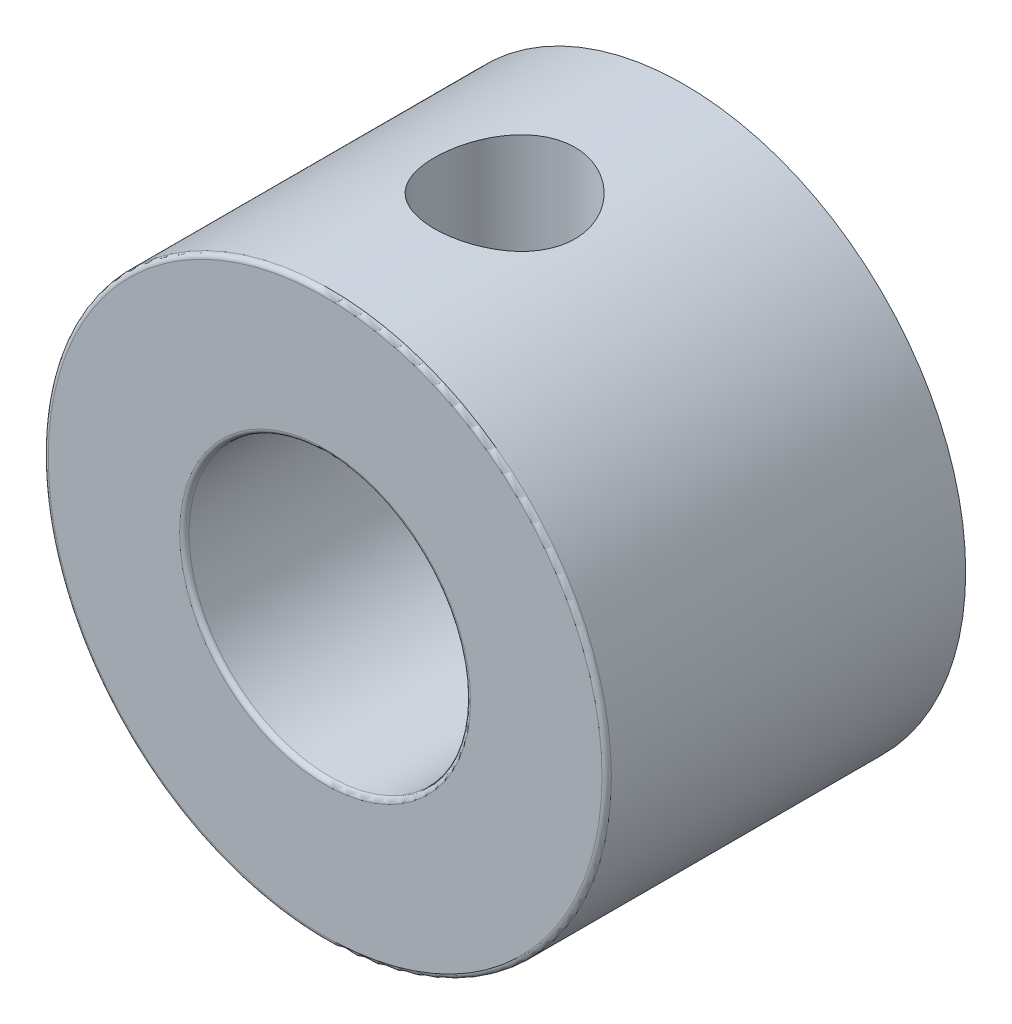
ISO-10303-21;
HEADER;
FILE_DESCRIPTION(('STEP AP214'),'2;1');
FILE_NAME('part.step','',(''),(''),'','','');
FILE_SCHEMA(('AUTOMOTIVE_DESIGN { 1 0 10303 214 1 1 1 1 }'));
ENDSEC;
DATA;
#1=APPLICATION_CONTEXT('core data for automotive mechanical design processes');
#2=APPLICATION_PROTOCOL_DEFINITION('international standard','automotive_design',2000,#1);
#3=PRODUCT_CONTEXT('',#1,'mechanical');
#4=PRODUCT('Part','Part','',(#3));
#5=PRODUCT_RELATED_PRODUCT_CATEGORY('part','',(#4));
#6=PRODUCT_DEFINITION_FORMATION('','',#4);
#7=PRODUCT_DEFINITION_CONTEXT('part definition',#1,'design');
#8=PRODUCT_DEFINITION('design','',#6,#7);
#9=PRODUCT_DEFINITION_SHAPE('','',#8);
#10=(LENGTH_UNIT() NAMED_UNIT(*) SI_UNIT(.MILLI.,.METRE.));
#11=(NAMED_UNIT(*) PLANE_ANGLE_UNIT() SI_UNIT($,.RADIAN.));
#12=(NAMED_UNIT(*) SI_UNIT($,.STERADIAN.) SOLID_ANGLE_UNIT());
#13=UNCERTAINTY_MEASURE_WITH_UNIT(LENGTH_MEASURE(1.E-05),#10,'distance_accuracy_value','');
#14=(GEOMETRIC_REPRESENTATION_CONTEXT(3) GLOBAL_UNCERTAINTY_ASSIGNED_CONTEXT((#13)) GLOBAL_UNIT_ASSIGNED_CONTEXT((#10,
#11,#12)) REPRESENTATION_CONTEXT('',''));
#15=CARTESIAN_POINT('',(0.,0.,0.));
#16=DIRECTION('',(0.,0.,1.));
#17=DIRECTION('',(1.,0.,0.));
#18=AXIS2_PLACEMENT_3D('',#15,#16,#17);
#19=CARTESIAN_POINT('',(0.,0.,3.825));
#20=DIRECTION('',(0.,0.,-1.));
#21=DIRECTION('',(-1.,0.,0.));
#22=AXIS2_PLACEMENT_3D('',#19,#20,#21);
#23=CYLINDRICAL_SURFACE('',#22,6.);
#24=CARTESIAN_POINT('',(0.,0.,3.725));
#25=DIRECTION('',(0.,0.,1.));
#26=DIRECTION('',(1.,0.,0.));
#27=AXIS2_PLACEMENT_3D('',#24,#25,#26);
#28=CIRCLE('',#27,6.);
#29=CARTESIAN_POINT('',(6.,0.,3.725));
#30=VERTEX_POINT('',#29);
#31=EDGE_CURVE('E10',#30,#30,#28,.F.);
#32=ORIENTED_EDGE('',*,*,#31,.T.);
#33=EDGE_LOOP('',(#32));
#34=FACE_BOUND('',#33,.T.);
#35=CARTESIAN_POINT('',(0.,0.,-3.825));
#36=DIRECTION('',(0.,0.,1.));
#37=DIRECTION('',(1.,0.,0.));
#38=AXIS2_PLACEMENT_3D('',#35,#36,#37);
#39=CIRCLE('',#38,6.);
#40=CARTESIAN_POINT('',(6.,0.,-3.825));
#41=VERTEX_POINT('',#40);
#42=EDGE_CURVE('E66',#41,#41,#39,.T.);
#43=ORIENTED_EDGE('',*,*,#42,.T.);
#44=EDGE_LOOP('',(#43));
#45=FACE_BOUND('',#44,.T.);
#46=CARTESIAN_POINT('',(0.,6.,-1.5));
#47=CARTESIAN_POINT('',(-0.0828760886697311,5.99999859868013,-1.49999767426184));
#48=CARTESIAN_POINT('',(-0.165778157830763,5.99826578131828,-1.49310844922621));
#49=CARTESIAN_POINT('',(-0.329206323770533,5.99152113829892,-1.465774848693));
#50=CARTESIAN_POINT('',(-0.409731046870739,5.98650745419968,-1.44532279046215));
#51=CARTESIAN_POINT('',(-0.566020872182577,5.9737562633204,-1.39156074653791));
#52=CARTESIAN_POINT('',(-0.641791563430003,5.96602202842087,-1.35826620128472));
#53=CARTESIAN_POINT('',(-0.786672131904427,5.94865343807593,-1.27981860995517));
#54=CARTESIAN_POINT('',(-0.85578178434876,5.9390190185405,-1.23466516388106));
#55=CARTESIAN_POINT('',(-0.98680192730092,5.91867413591801,-1.13279921034579));
#56=CARTESIAN_POINT('',(-1.04855569006107,5.90794707148533,-1.07588842504082));
#57=CARTESIAN_POINT('',(-1.1617489272033,5.8867362011753,-0.952547795091083));
#58=CARTESIAN_POINT('',(-1.21318723694913,5.87625242288348,-0.886116877053503));
#59=CARTESIAN_POINT('',(-1.30502654279903,5.8565477569971,-0.744404773262563));
#60=CARTESIAN_POINT('',(-1.34525221592536,5.84734794470605,-0.669006769189596));
#61=CARTESIAN_POINT('',(-1.41239690855053,5.83149494812223,-0.51225158834164));
#62=CARTESIAN_POINT('',(-1.43931805543933,5.82484135672789,-0.430895366674238));
#63=CARTESIAN_POINT('',(-1.47855483680429,5.81500476717551,-0.266256501797526));
#64=CARTESIAN_POINT('',(-1.49115226833334,5.81175491075426,-0.1830451039502));
#65=CARTESIAN_POINT('',(-1.50226177506785,5.80889362537741,-0.0156314309860182));
#66=CARTESIAN_POINT('',(-1.50077614181798,5.80928160448644,0.068570680698611));
#67=CARTESIAN_POINT('',(-1.48398652463928,5.81359205496618,0.233415807744482));
#68=CARTESIAN_POINT('',(-1.46901834019052,5.81742863001879,0.314095621465097));
#69=CARTESIAN_POINT('',(-1.42622418690311,5.82806709676484,0.471761050911293));
#70=CARTESIAN_POINT('',(-1.39839730206942,5.83486919970696,0.548746403028984));
#71=CARTESIAN_POINT('',(-1.33038947793715,5.85075113904187,0.697738016252066));
#72=CARTESIAN_POINT('',(-1.29008666723291,5.85985327469421,0.769686171789553));
#73=CARTESIAN_POINT('',(-1.19835627601495,5.87929710846386,0.905918709756838));
#74=CARTESIAN_POINT('',(-1.14692674880884,5.88963902334735,0.970201748067256));
#75=CARTESIAN_POINT('',(-1.03266342468122,5.91075880539781,1.0912036156944));
#76=CARTESIAN_POINT('',(-0.969546258165859,5.92154069477971,1.14765449006135));
#77=CARTESIAN_POINT('',(-0.8346119175037,5.94205965578786,1.2492212424639));
#78=CARTESIAN_POINT('',(-0.762794477707943,5.95179669549415,1.29433677426357));
#79=CARTESIAN_POINT('',(-0.612115888681391,5.96917732094183,1.37205058622439));
#80=CARTESIAN_POINT('',(-0.533231393208623,5.97681360127725,1.40460534025443));
#81=CARTESIAN_POINT('',(-0.370876008142883,5.98907916991419,1.45591730570957));
#82=CARTESIAN_POINT('',(-0.287405999150484,5.99370903339281,1.47467715641814));
#83=CARTESIAN_POINT('',(-0.120539970390026,5.99935499271375,1.49745756555884));
#84=CARTESIAN_POINT('',(-0.0371967199882089,6.00046053508279,1.5018430260753));
#85=CARTESIAN_POINT('',(0.129032874801509,5.99918804814451,1.49675099794451));
#86=CARTESIAN_POINT('',(0.211919259644596,5.99681033241847,1.48727475720087));
#87=CARTESIAN_POINT('',(0.373614268776492,5.98889581127357,1.45502909160862));
#88=CARTESIAN_POINT('',(0.452465118968755,5.98340634185811,1.43245873652301));
#89=CARTESIAN_POINT('',(0.605257292452512,5.96988706634134,1.37489291597155));
#90=CARTESIAN_POINT('',(0.679198119032635,5.96185700369892,1.33989619568683));
#91=CARTESIAN_POINT('',(0.821523134429848,5.94393307926311,1.25776387112527));
#92=CARTESIAN_POINT('',(0.889785441835831,5.93400867366932,1.21042388760324));
#93=CARTESIAN_POINT('',(1.01752661364325,5.91344509187419,1.10521009120303));
#94=CARTESIAN_POINT('',(1.07700395897301,5.90280579251705,1.04733446038309));
#95=CARTESIAN_POINT('',(1.18699056807273,5.88168956960771,0.920998039155535));
#96=CARTESIAN_POINT('',(1.23724386762203,5.87122304187281,0.852312296997577));
#97=CARTESIAN_POINT('',(1.3255107590127,5.85192878377239,0.707267365534282));
#98=CARTESIAN_POINT('',(1.36352489415794,5.84310098067026,0.630908517040246));
#99=CARTESIAN_POINT('',(1.42595142060929,5.82818094734665,0.473094277586921));
#100=CARTESIAN_POINT('',(1.45044439665407,5.82207255291906,0.39167237165599));
#101=CARTESIAN_POINT('',(1.48534565995378,5.81326744090184,0.225690362110891));
#102=CARTESIAN_POINT('',(1.49575702747866,5.81056997719936,0.141130948967509));
#103=CARTESIAN_POINT('',(1.50203859033399,5.80894901203957,-0.0261210238552032));
#104=CARTESIAN_POINT('',(1.49831789778012,5.80991932728264,-0.108797435124731));
#105=CARTESIAN_POINT('',(1.47737727831287,5.81527909007843,-0.272303888667982));
#106=CARTESIAN_POINT('',(1.46015762268677,5.81966846891857,-0.353133968013651));
#107=CARTESIAN_POINT('',(1.41293131944279,5.83131260682723,-0.510208459065409));
#108=CARTESIAN_POINT('',(1.38300140468038,5.8385501523631,-0.586477305240208));
#109=CARTESIAN_POINT('',(1.31126491360507,5.85507755724829,-0.73296538271369));
#110=CARTESIAN_POINT('',(1.26945669003419,5.86436770120773,-0.803183773186917));
#111=CARTESIAN_POINT('',(1.17386774863714,5.88425634263512,-0.937554629002021));
#112=CARTESIAN_POINT('',(1.11980316291225,5.89488264831757,-1.00150107342396));
#113=CARTESIAN_POINT('',(1.00178937118973,5.91608027246286,-1.11954704479541));
#114=CARTESIAN_POINT('',(0.937837821261145,5.9266515772706,-1.17364423011297));
#115=CARTESIAN_POINT('',(0.800467586702589,5.94677655647663,-1.27141130856461));
#116=CARTESIAN_POINT('',(0.726898422316385,5.95630833365868,-1.31487461367158));
#117=CARTESIAN_POINT('',(0.573266059510475,5.97304924975118,-1.38874746294053));
#118=CARTESIAN_POINT('',(0.493207563436738,5.98026005199781,-1.41916636064854));
#119=CARTESIAN_POINT('',(0.34441025324347,5.99048059565542,-1.46157183032965));
#120=CARTESIAN_POINT('',(0.276380170908067,5.99402585052691,-1.47595124305343));
#121=CARTESIAN_POINT('',(0.138906071536282,5.99878605231948,-1.49516594362194));
#122=CARTESIAN_POINT('',(0.0694621612426158,6.00000117450894,-1.5000019493053));
#123=CARTESIAN_POINT('',(0.,6.,-1.5));
#124=B_SPLINE_CURVE_WITH_KNOTS('',3,(#46,#47,#48,#49,#50,#51,#52,#53,#54,#55,#56,#57,#58,#59,
#60,#61,#62,#63,#64,#65,#66,#67,#68,#69,#70,#71,#72,#73,#74,#75,#76,#77,#78,#79,#80,#81,#82,#83,
#84,#85,#86,#87,#88,#89,#90,#91,#92,#93,#94,#95,#96,#97,#98,#99,#100,#101,#102,#103,#104,#105,
#106,#107,#108,#109,#110,#111,#112,#113,#114,#115,#116,#117,#118,#119,#120,#121,#122,#123),
.UNSPECIFIED.,.T.,.F.,(4,2,2,2,2,2,2,2,2,2,2,2,2,2,2,2,2,2,2,2,2,2,2,2,2,2,2,2,2,2,2,2,2,2,2,2,
2,2,4),(0.,0.24837371247189,0.4968882377639,0.745104902286106,0.993329940169329,
1.24614435437139,1.49898729580062,1.75558647545807,2.01214461169368,2.2635629509943,
2.51494038112697,2.76022497007018,3.00552703466038,3.25330527873879,3.50112690836163,
3.75601500969019,4.01091089558247,4.26668229009114,4.52240473688643,4.77158308949276,
5.02073901112743,5.26620274514037,5.51169127322291,5.76153587565352,6.01142363008019,
6.26744509204476,6.52345518749508,6.77792254614037,7.03233423252408,7.27943780398613,
7.52653640956034,7.77216400559447,8.01782568136901,8.2698957640991,8.52202569770418,
8.77872185499588,9.0352336382135,9.24342242942149,9.45159556043039),.UNSPECIFIED.);
#125=CARTESIAN_POINT('',(0.,6.,-1.5));
#126=VERTEX_POINT('',#125);
#127=EDGE_CURVE('E69',#126,#126,#124,.T.);
#128=ORIENTED_EDGE('',*,*,#127,.F.);
#129=EDGE_LOOP('',(#128));
#130=FACE_BOUND('',#129,.T.);
#131=ADVANCED_FACE('F35',(#34,#45,#130),#23,.T.);
#132=CARTESIAN_POINT('',(0.,0.,3.825));
#133=DIRECTION('',(0.,0.,-1.));
#134=DIRECTION('',(-1.,0.,0.));
#135=AXIS2_PLACEMENT_3D('',#132,#133,#134);
#136=CYLINDRICAL_SURFACE('',#135,3.);
#137=CARTESIAN_POINT('',(0.,0.,3.725));
#138=DIRECTION('',(0.,0.,1.));
#139=DIRECTION('',(1.,0.,0.));
#140=AXIS2_PLACEMENT_3D('',#137,#138,#139);
#141=CIRCLE('',#140,3.);
#142=CARTESIAN_POINT('',(3.,0.,3.725));
#143=VERTEX_POINT('',#142);
#144=EDGE_CURVE('E60',#143,#143,#141,.T.);
#145=ORIENTED_EDGE('',*,*,#144,.T.);
#146=EDGE_LOOP('',(#145));
#147=FACE_BOUND('',#146,.T.);
#148=CARTESIAN_POINT('',(0.,0.,-3.725));
#149=DIRECTION('',(0.,0.,1.));
#150=DIRECTION('',(1.,0.,0.));
#151=AXIS2_PLACEMENT_3D('',#148,#149,#150);
#152=CIRCLE('',#151,3.);
#153=CARTESIAN_POINT('',(3.,0.,-3.725));
#154=VERTEX_POINT('',#153);
#155=EDGE_CURVE('E57',#154,#154,#152,.F.);
#156=ORIENTED_EDGE('',*,*,#155,.T.);
#157=EDGE_LOOP('',(#156));
#158=FACE_BOUND('',#157,.T.);
#159=CARTESIAN_POINT('',(0.,3.,-1.5));
#160=CARTESIAN_POINT('',(-0.0788579444268502,2.99999570107562,-1.49999504652421));
#161=CARTESIAN_POINT('',(-0.157809899546344,2.99685736529635,-1.49374489031842));
#162=CARTESIAN_POINT('',(-0.313380352903344,2.98461234055736,-1.46902067948769));
#163=CARTESIAN_POINT('',(-0.389994130070444,2.97549431743379,-1.45052341050328));
#164=CARTESIAN_POINT('',(-0.538400317320674,2.95224419105063,-1.40220928707506));
#165=CARTESIAN_POINT('',(-0.61021020440872,2.93813158766306,-1.37243642362805));
#166=CARTESIAN_POINT('',(-0.747708925209898,2.90618664773642,-1.30264406795252));
#167=CARTESIAN_POINT('',(-0.813398240985089,2.88835460450288,-1.2626253836267));
#168=CARTESIAN_POINT('',(-0.941261726642864,2.84934387387093,-1.17072412577207));
#169=CARTESIAN_POINT('',(-1.00298281668316,2.82802798691306,-1.11827028114054));
#170=CARTESIAN_POINT('',(-1.11716916730047,2.78489955370115,-1.00421778112945));
#171=CARTESIAN_POINT('',(-1.16962737466015,2.76308664313552,-0.942612222341338));
#172=CARTESIAN_POINT('',(-1.26787800067542,2.71948426796021,-0.806274975714928));
#173=CARTESIAN_POINT('',(-1.31283800332746,2.69782780455198,-0.730895852481131));
#174=CARTESIAN_POINT('',(-1.38925234033604,2.65928968158481,-0.572448996020678));
#175=CARTESIAN_POINT('',(-1.4207163224495,2.64240461410484,-0.489386806915876));
#176=CARTESIAN_POINT('',(-1.46719866328288,2.61686800556713,-0.323002341867116));
#177=CARTESIAN_POINT('',(-1.48308878562066,2.6077840737557,-0.239993321898909));
#178=CARTESIAN_POINT('',(-1.50064048996327,2.59772834922792,-0.0720317433307849));
#179=CARTESIAN_POINT('',(-1.50231613255961,2.59674854014932,0.0129188113067319));
#180=CARTESIAN_POINT('',(-1.49203093075844,2.60266395385873,0.171429036473052));
#181=CARTESIAN_POINT('',(-1.48167683930523,2.6086314549302,0.245136046834576));
#182=CARTESIAN_POINT('',(-1.4504097735854,2.62614343100775,0.389582864059563));
#183=CARTESIAN_POINT('',(-1.42949343584648,2.63768968247664,0.460321717957974));
#184=CARTESIAN_POINT('',(-1.37731467057901,2.66531214619112,0.598843698848489));
#185=CARTESIAN_POINT('',(-1.34582260067399,2.68148760995998,0.666519598178684));
#186=CARTESIAN_POINT('',(-1.273562531502,2.71655106422106,0.795951438885012));
#187=CARTESIAN_POINT('',(-1.2327903657187,2.73544027170286,0.857704703400133));
#188=CARTESIAN_POINT('',(-1.13709908236918,2.77669736854929,0.981781879114839));
#189=CARTESIAN_POINT('',(-1.08104168755392,2.79920265355119,1.04318531036424));
#190=CARTESIAN_POINT('',(-0.95933336811206,2.84321434950611,1.15610312788635));
#191=CARTESIAN_POINT('',(-0.893677884861428,2.86472027938201,1.20761278805082));
#192=CARTESIAN_POINT('',(-0.750774758747772,2.90552980924446,1.30152849154459));
#193=CARTESIAN_POINT('',(-0.673130387399113,2.92468476243011,1.34340070866861));
#194=CARTESIAN_POINT('',(-0.510699323233195,2.95736821681863,1.41314554356451));
#195=CARTESIAN_POINT('',(-0.425918364397914,2.9709011841533,1.44102927752275));
#196=CARTESIAN_POINT('',(-0.259149737491053,2.98986500612153,1.47971310557502));
#197=CARTESIAN_POINT('',(-0.177512295822489,2.99587407451965,1.49173685362017));
#198=CARTESIAN_POINT('',(-0.0131693999240274,3.00109520188655,1.50219709670173));
#199=CARTESIAN_POINT('',(0.0695355298048631,3.00031048081978,1.5006400284592));
#200=CARTESIAN_POINT('',(0.22684945797898,2.99236788380152,1.48468996737188));
#201=CARTESIAN_POINT('',(0.301589112074895,2.98570868532253,1.47130120090501));
#202=CARTESIAN_POINT('',(0.447610338452912,2.9673325697226,1.43364289215732));
#203=CARTESIAN_POINT('',(0.51889152853663,2.95561509501618,1.40937215031976));
#204=CARTESIAN_POINT('',(0.658332912674359,2.92776377120382,1.35000230035045));
#205=CARTESIAN_POINT('',(0.726345595508705,2.91151322654446,1.31461342482557));
#206=CARTESIAN_POINT('',(0.855692042548907,2.87615961476126,1.23433869653015));
#207=CARTESIAN_POINT('',(0.917022944664888,2.85705533350407,1.18944879810691));
#208=CARTESIAN_POINT('',(1.03765153393382,2.81562332004297,1.08635936200393));
#209=CARTESIAN_POINT('',(1.09615811672854,2.79316327265249,1.02728569733228));
#210=CARTESIAN_POINT('',(1.20278448167828,2.7489358741323,0.900112273083409));
#211=CARTESIAN_POINT('',(1.25089707856781,2.72716901100071,0.832006321728121));
#212=CARTESIAN_POINT('',(1.33756187171853,2.68576788309734,0.684534518740537));
#213=CARTESIAN_POINT('',(1.37553824370037,2.66628794383591,0.604783100858278));
#214=CARTESIAN_POINT('',(1.43712423890206,2.63361108441202,0.438734898637551));
#215=CARTESIAN_POINT('',(1.46075237380052,2.62040607332625,0.352446710299665));
#216=CARTESIAN_POINT('',(1.49079253120031,2.60342251538703,0.184634665672944));
#217=CARTESIAN_POINT('',(1.49863949460818,2.59886075197597,0.103448619847138));
#218=CARTESIAN_POINT('',(1.5010337315643,2.59748031962405,-0.0591706007467874));
#219=CARTESIAN_POINT('',(1.49558676993486,2.60065829439585,-0.140603653106792));
#220=CARTESIAN_POINT('',(1.47288918838996,2.61356793076615,-0.293225252300155));
#221=CARTESIAN_POINT('',(1.45681247151455,2.62264641723988,-0.364650705217109));
#222=CARTESIAN_POINT('',(1.41476303733662,2.64556524281479,-0.50371217913655));
#223=CARTESIAN_POINT('',(1.38878713673988,2.65940711354503,-0.571346973138047));
#224=CARTESIAN_POINT('',(1.32572361795085,2.69142795546804,-0.705937276479805));
#225=CARTESIAN_POINT('',(1.28800670672355,2.70983583593881,-0.772541852743543));
#226=CARTESIAN_POINT('',(1.20322645745609,2.74852997452291,-0.898911804271888));
#227=CARTESIAN_POINT('',(1.15615825686234,2.76881720693416,-0.958673595781668));
#228=CARTESIAN_POINT('',(1.04730498999206,2.81193484737138,-1.07721297353201));
#229=CARTESIAN_POINT('',(0.984426634495892,2.83477474959942,-1.13498865352544));
#230=CARTESIAN_POINT('',(0.849232209349796,2.87816628389896,-1.2393944751529));
#231=CARTESIAN_POINT('',(0.776911084957796,2.89871667939293,-1.28601860920486));
#232=CARTESIAN_POINT('',(0.623897395174419,2.93547014349806,-1.3668545440681));
#233=CARTESIAN_POINT('',(0.543149255665096,2.95164144740899,-1.4009762538547));
#234=CARTESIAN_POINT('',(0.37611315170713,2.9775201194848,-1.45471225163611));
#235=CARTESIAN_POINT('',(0.28984169938365,2.98724585044602,-1.47436777020857));
#236=CARTESIAN_POINT('',(0.168902919736342,2.99543192870217,-1.49084611662861));
#237=CARTESIAN_POINT('',(0.135242819162347,2.99714048010376,-1.49427396129951));
#238=CARTESIAN_POINT('',(0.0677275977076368,2.99942545465223,-1.49885199827113));
#239=CARTESIAN_POINT('',(0.0338724714699424,3.00000184655071,-1.50000212770531));
#240=CARTESIAN_POINT('',(0.,3.,-1.5));
#241=B_SPLINE_CURVE_WITH_KNOTS('',3,(#159,#160,#161,#162,#163,#164,#165,#166,#167,#168,#169,
#170,#171,#172,#173,#174,#175,#176,#177,#178,#179,#180,#181,#182,#183,#184,#185,#186,#187,#188,
#189,#190,#191,#192,#193,#194,#195,#196,#197,#198,#199,#200,#201,#202,#203,#204,#205,#206,#207,
#208,#209,#210,#211,#212,#213,#214,#215,#216,#217,#218,#219,#220,#221,#222,#223,#224,#225,#226,
#227,#228,#229,#230,#231,#232,#233,#234,#235,#236,#237,#238,#239,#240),.UNSPECIFIED.,.T.,.F.,(4,
2,2,2,2,2,2,2,2,2,2,2,2,2,2,2,2,2,2,2,2,2,2,2,2,2,2,2,2,2,2,2,2,2,2,2,2,2,2,2,4),(0.,
0.236436386130439,0.473322224563797,0.709293233238448,0.945245640872352,1.19547263807713,
1.44588935648105,1.71572589646129,1.98536921847421,2.23887018210344,2.49212035993531,
2.71508568613981,2.93812205888518,3.16635360252731,3.39468781890333,3.65197412000818,
3.90938301898029,4.17874533321661,4.44789325368419,4.69474935707018,4.94148846767214,
5.16910359759183,5.39674382446397,5.63089284041848,5.86514176122509,6.12239415966628,
6.37982382923147,6.64972023242589,6.91926767918176,7.1629396125457,7.40650589797017,
7.62686895373283,7.84730293182526,8.08254685170431,8.31791341715446,8.58187864135757,
8.84598575071868,9.1119602049529,9.37717362931724,9.47872920200875,9.58028757766599),.UNSPECIFIED.);
#242=CARTESIAN_POINT('',(0.,3.,-1.5));
#243=VERTEX_POINT('',#242);
#244=EDGE_CURVE('E39',#243,#243,#241,.T.);
#245=ORIENTED_EDGE('',*,*,#244,.T.);
#246=EDGE_LOOP('',(#245));
#247=FACE_BOUND('',#246,.T.);
#248=ADVANCED_FACE('F82',(#147,#158,#247),#136,.F.);
#249=CARTESIAN_POINT('',(0.,0.,3.825));
#250=DIRECTION('',(0.,0.,1.));
#251=DIRECTION('',(1.,0.,0.));
#252=AXIS2_PLACEMENT_3D('',#249,#250,#251);
#253=PLANE('',#252);
#254=CARTESIAN_POINT('',(0.,0.,3.825));
#255=DIRECTION('',(0.,0.,1.));
#256=DIRECTION('',(1.,0.,0.));
#257=AXIS2_PLACEMENT_3D('',#254,#255,#256);
#258=CIRCLE('',#257,3.1);
#259=CARTESIAN_POINT('',(3.1,0.,3.825));
#260=VERTEX_POINT('',#259);
#261=EDGE_CURVE('E48',#260,#260,#258,.F.);
#262=ORIENTED_EDGE('',*,*,#261,.T.);
#263=EDGE_LOOP('',(#262));
#264=FACE_BOUND('',#263,.T.);
#265=CARTESIAN_POINT('',(0.,0.,3.825));
#266=DIRECTION('',(0.,0.,1.));
#267=DIRECTION('',(1.,0.,0.));
#268=AXIS2_PLACEMENT_3D('',#265,#266,#267);
#269=CIRCLE('',#268,5.9);
#270=CARTESIAN_POINT('',(5.9,0.,3.825));
#271=VERTEX_POINT('',#270);
#272=EDGE_CURVE('E52',#271,#271,#269,.T.);
#273=ORIENTED_EDGE('',*,*,#272,.T.);
#274=EDGE_LOOP('',(#273));
#275=FACE_BOUND('',#274,.T.);
#276=ADVANCED_FACE('F87',(#264,#275),#253,.T.);
#277=CARTESIAN_POINT('',(0.,0.,-3.825));
#278=DIRECTION('',(0.,0.,1.));
#279=DIRECTION('',(1.,0.,0.));
#280=AXIS2_PLACEMENT_3D('',#277,#278,#279);
#281=PLANE('',#280);
#282=CARTESIAN_POINT('',(0.,0.,-3.825));
#283=DIRECTION('',(0.,0.,1.));
#284=DIRECTION('',(1.,0.,0.));
#285=AXIS2_PLACEMENT_3D('',#282,#283,#284);
#286=CIRCLE('',#285,3.1);
#287=CARTESIAN_POINT('',(3.1,0.,-3.825));
#288=VERTEX_POINT('',#287);
#289=EDGE_CURVE('E63',#288,#288,#286,.T.);
#290=ORIENTED_EDGE('',*,*,#289,.T.);
#291=EDGE_LOOP('',(#290));
#292=FACE_BOUND('',#291,.T.);
#293=ORIENTED_EDGE('',*,*,#42,.F.);
#294=EDGE_LOOP('',(#293));
#295=FACE_BOUND('',#294,.T.);
#296=ADVANCED_FACE('F90',(#292,#295),#281,.F.);
#297=CARTESIAN_POINT('',(0.,0.,-3.725));
#298=DIRECTION('',(0.,0.,1.));
#299=DIRECTION('',(1.,0.,0.));
#300=AXIS2_PLACEMENT_3D('',#297,#298,#299);
#301=TOROIDAL_SURFACE('',#300,3.1,0.1);
#302=ORIENTED_EDGE('',*,*,#155,.F.);
#303=EDGE_LOOP('',(#302));
#304=FACE_BOUND('',#303,.T.);
#305=ORIENTED_EDGE('',*,*,#289,.F.);
#306=EDGE_LOOP('',(#305));
#307=FACE_BOUND('',#306,.T.);
#308=ADVANCED_FACE('F93',(#304,#307),#301,.T.);
#309=CARTESIAN_POINT('',(0.,0.,3.725));
#310=DIRECTION('',(0.,0.,1.));
#311=DIRECTION('',(1.,0.,0.));
#312=AXIS2_PLACEMENT_3D('',#309,#310,#311);
#313=TOROIDAL_SURFACE('',#312,3.1,0.1);
#314=ORIENTED_EDGE('',*,*,#261,.F.);
#315=EDGE_LOOP('',(#314));
#316=FACE_BOUND('',#315,.T.);
#317=ORIENTED_EDGE('',*,*,#144,.F.);
#318=EDGE_LOOP('',(#317));
#319=FACE_BOUND('',#318,.T.);
#320=ADVANCED_FACE('F98',(#316,#319),#313,.T.);
#321=CARTESIAN_POINT('',(0.,0.,3.725));
#322=DIRECTION('',(0.,0.,1.));
#323=DIRECTION('',(1.,0.,0.));
#324=AXIS2_PLACEMENT_3D('',#321,#322,#323);
#325=TOROIDAL_SURFACE('',#324,5.9,0.1);
#326=ORIENTED_EDGE('',*,*,#31,.F.);
#327=EDGE_LOOP('',(#326));
#328=FACE_BOUND('',#327,.T.);
#329=ORIENTED_EDGE('',*,*,#272,.F.);
#330=EDGE_LOOP('',(#329));
#331=FACE_BOUND('',#330,.T.);
#332=ADVANCED_FACE('F37',(#328,#331),#325,.T.);
#333=CARTESIAN_POINT('',(0.,7.65,0.));
#334=DIRECTION('',(0.,-1.,0.));
#335=DIRECTION('',(0.,0.,-1.));
#336=AXIS2_PLACEMENT_3D('',#333,#334,#335);
#337=CYLINDRICAL_SURFACE('',#336,1.5);
#338=ORIENTED_EDGE('',*,*,#244,.F.);
#339=EDGE_LOOP('',(#338));
#340=FACE_BOUND('',#339,.T.);
#341=ORIENTED_EDGE('',*,*,#127,.T.);
#342=EDGE_LOOP('',(#341));
#343=FACE_BOUND('',#342,.T.);
#344=ADVANCED_FACE('F78',(#340,#343),#337,.F.);
#345=CLOSED_SHELL('',(#131,#248,#276,#296,#308,#320,#332,#344));
#346=MANIFOLD_SOLID_BREP('B2',#345);
#347=ADVANCED_BREP_SHAPE_REPRESENTATION('',(#18,#346),#14);
#348=SHAPE_DEFINITION_REPRESENTATION(#9,#347);
ENDSEC;
END-ISO-10303-21;
